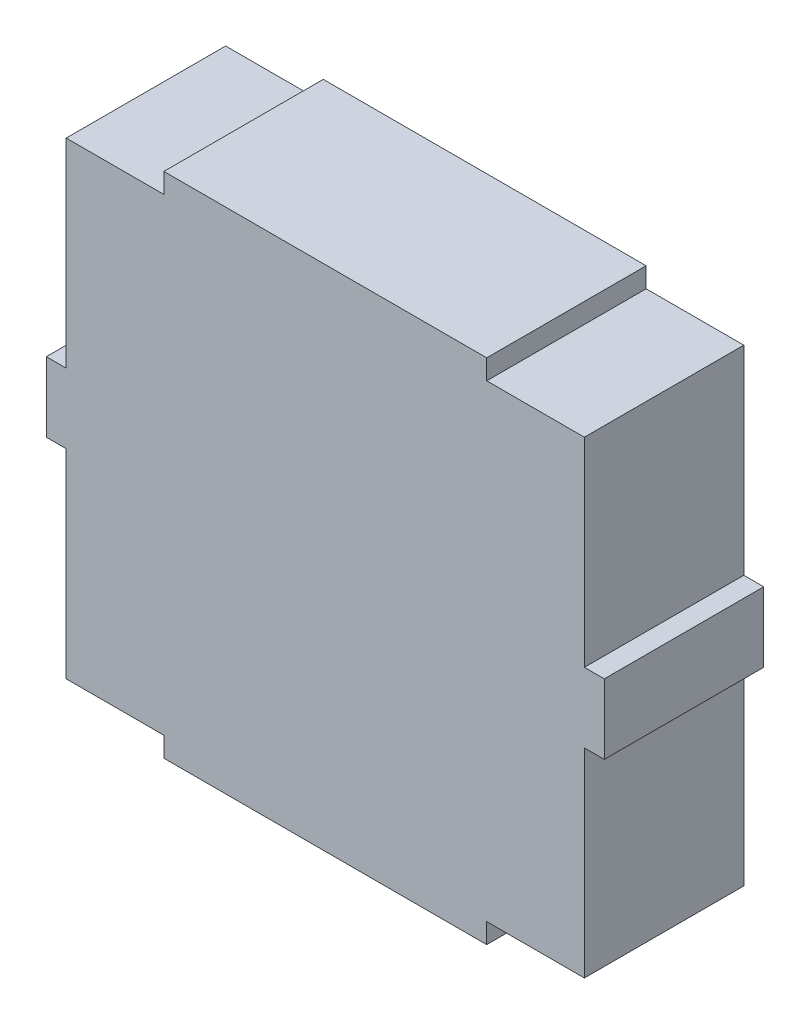
ISO-10303-21;
HEADER;
FILE_DESCRIPTION(('STEP AP214'),'2;1');
FILE_NAME('part.step','',(''),(''),'','','');
FILE_SCHEMA(('AUTOMOTIVE_DESIGN { 1 0 10303 214 1 1 1 1 }'));
ENDSEC;
DATA;
#1=APPLICATION_CONTEXT('core data for automotive mechanical design processes');
#2=APPLICATION_PROTOCOL_DEFINITION('international standard','automotive_design',2000,#1);
#3=PRODUCT_CONTEXT('',#1,'mechanical');
#4=PRODUCT('Part','Part','',(#3));
#5=PRODUCT_RELATED_PRODUCT_CATEGORY('part','',(#4));
#6=PRODUCT_DEFINITION_FORMATION('','',#4);
#7=PRODUCT_DEFINITION_CONTEXT('part definition',#1,'design');
#8=PRODUCT_DEFINITION('design','',#6,#7);
#9=PRODUCT_DEFINITION_SHAPE('','',#8);
#10=(LENGTH_UNIT() NAMED_UNIT(*) SI_UNIT(.MILLI.,.METRE.));
#11=(NAMED_UNIT(*) PLANE_ANGLE_UNIT() SI_UNIT($,.RADIAN.));
#12=(NAMED_UNIT(*) SI_UNIT($,.STERADIAN.) SOLID_ANGLE_UNIT());
#13=UNCERTAINTY_MEASURE_WITH_UNIT(LENGTH_MEASURE(1.E-05),#10,'distance_accuracy_value','');
#14=(GEOMETRIC_REPRESENTATION_CONTEXT(3) GLOBAL_UNCERTAINTY_ASSIGNED_CONTEXT((#13)) GLOBAL_UNIT_ASSIGNED_CONTEXT((#10,
#11,#12)) REPRESENTATION_CONTEXT('',''));
#15=CARTESIAN_POINT('',(0.,0.,0.));
#16=DIRECTION('',(0.,0.,1.));
#17=DIRECTION('',(1.,0.,0.));
#18=AXIS2_PLACEMENT_3D('',#15,#16,#17);
#19=CARTESIAN_POINT('',(1.62,-2.55,1.6));
#20=DIRECTION('',(0.,1.,0.));
#21=DIRECTION('',(0.,0.,1.));
#22=AXIS2_PLACEMENT_3D('',#19,#20,#21);
#23=PLANE('',#22);
#24=DIRECTION('',(1.,0.,0.));
#25=VECTOR('',#24,1.);
#26=CARTESIAN_POINT('',(1.62,-2.55,0.));
#27=LINE('',#26,#25);
#28=CARTESIAN_POINT('',(-1.62,-2.55,0.));
#29=VERTEX_POINT('',#28);
#30=CARTESIAN_POINT('',(1.62,-2.55,0.));
#31=VERTEX_POINT('',#30);
#32=EDGE_CURVE('E201',#29,#31,#27,.T.);
#33=ORIENTED_EDGE('',*,*,#32,.T.);
#34=DIRECTION('',(0.,0.,-1.));
#35=VECTOR('',#34,1.);
#36=CARTESIAN_POINT('',(1.62,-2.55,1.6));
#37=LINE('',#36,#35);
#38=CARTESIAN_POINT('',(1.62,-2.55,1.6));
#39=VERTEX_POINT('',#38);
#40=EDGE_CURVE('E11',#39,#31,#37,.T.);
#41=ORIENTED_EDGE('',*,*,#40,.F.);
#42=DIRECTION('',(1.,0.,0.));
#43=VECTOR('',#42,1.);
#44=CARTESIAN_POINT('',(1.62,-2.55,1.6));
#45=LINE('',#44,#43);
#46=CARTESIAN_POINT('',(-1.62,-2.55,1.6));
#47=VERTEX_POINT('',#46);
#48=EDGE_CURVE('E240',#47,#39,#45,.T.);
#49=ORIENTED_EDGE('',*,*,#48,.F.);
#50=DIRECTION('',(0.,0.,-1.));
#51=VECTOR('',#50,1.);
#52=CARTESIAN_POINT('',(-1.62,-2.55,1.6));
#53=LINE('',#52,#51);
#54=EDGE_CURVE('E197',#47,#29,#53,.T.);
#55=ORIENTED_EDGE('',*,*,#54,.T.);
#56=EDGE_LOOP('',(#33,#41,#49,#55));
#57=FACE_BOUND('',#56,.T.);
#58=ADVANCED_FACE('F34',(#57),#23,.F.);
#59=CARTESIAN_POINT('',(1.62,-2.35,1.6));
#60=DIRECTION('',(-1.,0.,0.));
#61=DIRECTION('',(0.,0.,1.));
#62=AXIS2_PLACEMENT_3D('',#59,#60,#61);
#63=PLANE('',#62);
#64=DIRECTION('',(0.,1.,0.));
#65=VECTOR('',#64,1.);
#66=CARTESIAN_POINT('',(1.62,-2.35,0.));
#67=LINE('',#66,#65);
#68=CARTESIAN_POINT('',(1.62,-2.35,0.));
#69=VERTEX_POINT('',#68);
#70=EDGE_CURVE('E204',#31,#69,#67,.T.);
#71=ORIENTED_EDGE('',*,*,#70,.T.);
#72=DIRECTION('',(0.,0.,-1.));
#73=VECTOR('',#72,1.);
#74=CARTESIAN_POINT('',(1.62,-2.35,1.6));
#75=LINE('',#74,#73);
#76=CARTESIAN_POINT('',(1.62,-2.35,1.6));
#77=VERTEX_POINT('',#76);
#78=EDGE_CURVE('E42',#77,#69,#75,.T.);
#79=ORIENTED_EDGE('',*,*,#78,.F.);
#80=DIRECTION('',(0.,1.,0.));
#81=VECTOR('',#80,1.);
#82=CARTESIAN_POINT('',(1.62,-2.35,1.6));
#83=LINE('',#82,#81);
#84=EDGE_CURVE('E129',#39,#77,#83,.T.);
#85=ORIENTED_EDGE('',*,*,#84,.F.);
#86=ORIENTED_EDGE('',*,*,#40,.T.);
#87=EDGE_LOOP('',(#71,#79,#85,#86));
#88=FACE_BOUND('',#87,.T.);
#89=ADVANCED_FACE('F359',(#88),#63,.F.);
#90=CARTESIAN_POINT('',(2.6,-2.35,1.6));
#91=DIRECTION('',(0.,1.,0.));
#92=DIRECTION('',(0.,0.,1.));
#93=AXIS2_PLACEMENT_3D('',#90,#91,#92);
#94=PLANE('',#93);
#95=DIRECTION('',(1.,0.,0.));
#96=VECTOR('',#95,1.);
#97=CARTESIAN_POINT('',(2.6,-2.35,0.));
#98=LINE('',#97,#96);
#99=CARTESIAN_POINT('',(2.6,-2.35,0.));
#100=VERTEX_POINT('',#99);
#101=EDGE_CURVE('E206',#69,#100,#98,.T.);
#102=ORIENTED_EDGE('',*,*,#101,.T.);
#103=DIRECTION('',(0.,0.,-1.));
#104=VECTOR('',#103,1.);
#105=CARTESIAN_POINT('',(2.6,-2.35,1.6));
#106=LINE('',#105,#104);
#107=CARTESIAN_POINT('',(2.6,-2.35,1.6));
#108=VERTEX_POINT('',#107);
#109=EDGE_CURVE('E283',#108,#100,#106,.T.);
#110=ORIENTED_EDGE('',*,*,#109,.F.);
#111=DIRECTION('',(1.,0.,0.));
#112=VECTOR('',#111,1.);
#113=CARTESIAN_POINT('',(2.6,-2.35,1.6));
#114=LINE('',#113,#112);
#115=EDGE_CURVE('E291',#77,#108,#114,.T.);
#116=ORIENTED_EDGE('',*,*,#115,.F.);
#117=ORIENTED_EDGE('',*,*,#78,.T.);
#118=EDGE_LOOP('',(#102,#110,#116,#117));
#119=FACE_BOUND('',#118,.T.);
#120=ADVANCED_FACE('F289',(#119),#94,.F.);
#121=CARTESIAN_POINT('',(2.6,-0.35,1.6));
#122=DIRECTION('',(-1.,0.,0.));
#123=DIRECTION('',(0.,0.,1.));
#124=AXIS2_PLACEMENT_3D('',#121,#122,#123);
#125=PLANE('',#124);
#126=DIRECTION('',(0.,1.,0.));
#127=VECTOR('',#126,1.);
#128=CARTESIAN_POINT('',(2.6,-0.35,0.));
#129=LINE('',#128,#127);
#130=CARTESIAN_POINT('',(2.6,-0.35,0.));
#131=VERTEX_POINT('',#130);
#132=EDGE_CURVE('E208',#100,#131,#129,.T.);
#133=ORIENTED_EDGE('',*,*,#132,.T.);
#134=DIRECTION('',(0.,0.,-1.));
#135=VECTOR('',#134,1.);
#136=CARTESIAN_POINT('',(2.6,-0.35,1.6));
#137=LINE('',#136,#135);
#138=CARTESIAN_POINT('',(2.6,-0.35,1.6));
#139=VERTEX_POINT('',#138);
#140=EDGE_CURVE('E280',#139,#131,#137,.T.);
#141=ORIENTED_EDGE('',*,*,#140,.F.);
#142=DIRECTION('',(0.,1.,0.));
#143=VECTOR('',#142,1.);
#144=CARTESIAN_POINT('',(2.6,-0.35,1.6));
#145=LINE('',#144,#143);
#146=EDGE_CURVE('E309',#108,#139,#145,.T.);
#147=ORIENTED_EDGE('',*,*,#146,.F.);
#148=ORIENTED_EDGE('',*,*,#109,.T.);
#149=EDGE_LOOP('',(#133,#141,#147,#148));
#150=FACE_BOUND('',#149,.T.);
#151=ADVANCED_FACE('F300',(#150),#125,.F.);
#152=CARTESIAN_POINT('',(2.8,-0.35,1.6));
#153=DIRECTION('',(0.,1.,0.));
#154=DIRECTION('',(0.,0.,1.));
#155=AXIS2_PLACEMENT_3D('',#152,#153,#154);
#156=PLANE('',#155);
#157=DIRECTION('',(1.,0.,0.));
#158=VECTOR('',#157,1.);
#159=CARTESIAN_POINT('',(2.8,-0.35,0.));
#160=LINE('',#159,#158);
#161=CARTESIAN_POINT('',(2.8,-0.35,0.));
#162=VERTEX_POINT('',#161);
#163=EDGE_CURVE('E210',#131,#162,#160,.T.);
#164=ORIENTED_EDGE('',*,*,#163,.T.);
#165=DIRECTION('',(0.,0.,-1.));
#166=VECTOR('',#165,1.);
#167=CARTESIAN_POINT('',(2.8,-0.35,1.6));
#168=LINE('',#167,#166);
#169=CARTESIAN_POINT('',(2.8,-0.35,1.6));
#170=VERTEX_POINT('',#169);
#171=EDGE_CURVE('E277',#170,#162,#168,.T.);
#172=ORIENTED_EDGE('',*,*,#171,.F.);
#173=DIRECTION('',(1.,0.,0.));
#174=VECTOR('',#173,1.);
#175=CARTESIAN_POINT('',(2.8,-0.35,1.6));
#176=LINE('',#175,#174);
#177=EDGE_CURVE('E306',#139,#170,#176,.T.);
#178=ORIENTED_EDGE('',*,*,#177,.F.);
#179=ORIENTED_EDGE('',*,*,#140,.T.);
#180=EDGE_LOOP('',(#164,#172,#178,#179));
#181=FACE_BOUND('',#180,.T.);
#182=ADVANCED_FACE('F304',(#181),#156,.F.);
#183=CARTESIAN_POINT('',(2.8,0.35,1.6));
#184=DIRECTION('',(-1.,0.,0.));
#185=DIRECTION('',(0.,0.,1.));
#186=AXIS2_PLACEMENT_3D('',#183,#184,#185);
#187=PLANE('',#186);
#188=DIRECTION('',(0.,1.,0.));
#189=VECTOR('',#188,1.);
#190=CARTESIAN_POINT('',(2.8,0.35,0.));
#191=LINE('',#190,#189);
#192=CARTESIAN_POINT('',(2.8,0.35,0.));
#193=VERTEX_POINT('',#192);
#194=EDGE_CURVE('E212',#162,#193,#191,.T.);
#195=ORIENTED_EDGE('',*,*,#194,.T.);
#196=DIRECTION('',(0.,0.,-1.));
#197=VECTOR('',#196,1.);
#198=CARTESIAN_POINT('',(2.8,0.35,1.6));
#199=LINE('',#198,#197);
#200=CARTESIAN_POINT('',(2.8,0.35,1.6));
#201=VERTEX_POINT('',#200);
#202=EDGE_CURVE('E274',#201,#193,#199,.T.);
#203=ORIENTED_EDGE('',*,*,#202,.F.);
#204=DIRECTION('',(0.,1.,0.));
#205=VECTOR('',#204,1.);
#206=CARTESIAN_POINT('',(2.8,0.35,1.6));
#207=LINE('',#206,#205);
#208=EDGE_CURVE('E308',#170,#201,#207,.T.);
#209=ORIENTED_EDGE('',*,*,#208,.F.);
#210=ORIENTED_EDGE('',*,*,#171,.T.);
#211=EDGE_LOOP('',(#195,#203,#209,#210));
#212=FACE_BOUND('',#211,.T.);
#213=ADVANCED_FACE('F372',(#212),#187,.F.);
#214=CARTESIAN_POINT('',(2.6,0.35,1.6));
#215=DIRECTION('',(0.,-1.,0.));
#216=DIRECTION('',(0.,0.,-1.));
#217=AXIS2_PLACEMENT_3D('',#214,#215,#216);
#218=PLANE('',#217);
#219=DIRECTION('',(-1.,0.,0.));
#220=VECTOR('',#219,1.);
#221=CARTESIAN_POINT('',(2.6,0.35,0.));
#222=LINE('',#221,#220);
#223=CARTESIAN_POINT('',(2.6,0.35,0.));
#224=VERTEX_POINT('',#223);
#225=EDGE_CURVE('E214',#193,#224,#222,.T.);
#226=ORIENTED_EDGE('',*,*,#225,.T.);
#227=DIRECTION('',(0.,0.,-1.));
#228=VECTOR('',#227,1.);
#229=CARTESIAN_POINT('',(2.6,0.35,1.6));
#230=LINE('',#229,#228);
#231=CARTESIAN_POINT('',(2.6,0.35,1.6));
#232=VERTEX_POINT('',#231);
#233=EDGE_CURVE('E271',#232,#224,#230,.T.);
#234=ORIENTED_EDGE('',*,*,#233,.F.);
#235=DIRECTION('',(-1.,0.,0.));
#236=VECTOR('',#235,1.);
#237=CARTESIAN_POINT('',(2.6,0.35,1.6));
#238=LINE('',#237,#236);
#239=EDGE_CURVE('E311',#201,#232,#238,.T.);
#240=ORIENTED_EDGE('',*,*,#239,.F.);
#241=ORIENTED_EDGE('',*,*,#202,.T.);
#242=EDGE_LOOP('',(#226,#234,#240,#241));
#243=FACE_BOUND('',#242,.T.);
#244=ADVANCED_FACE('F375',(#243),#218,.F.);
#245=CARTESIAN_POINT('',(2.6,2.35,1.6));
#246=DIRECTION('',(-1.,0.,0.));
#247=DIRECTION('',(0.,0.,1.));
#248=AXIS2_PLACEMENT_3D('',#245,#246,#247);
#249=PLANE('',#248);
#250=DIRECTION('',(0.,1.,0.));
#251=VECTOR('',#250,1.);
#252=CARTESIAN_POINT('',(2.6,2.35,0.));
#253=LINE('',#252,#251);
#254=CARTESIAN_POINT('',(2.6,2.35,0.));
#255=VERTEX_POINT('',#254);
#256=EDGE_CURVE('E216',#224,#255,#253,.T.);
#257=ORIENTED_EDGE('',*,*,#256,.T.);
#258=DIRECTION('',(0.,0.,-1.));
#259=VECTOR('',#258,1.);
#260=CARTESIAN_POINT('',(2.6,2.35,1.6));
#261=LINE('',#260,#259);
#262=CARTESIAN_POINT('',(2.6,2.35,1.6));
#263=VERTEX_POINT('',#262);
#264=EDGE_CURVE('E268',#263,#255,#261,.T.);
#265=ORIENTED_EDGE('',*,*,#264,.F.);
#266=DIRECTION('',(0.,1.,0.));
#267=VECTOR('',#266,1.);
#268=CARTESIAN_POINT('',(2.6,2.35,1.6));
#269=LINE('',#268,#267);
#270=EDGE_CURVE('E317',#232,#263,#269,.T.);
#271=ORIENTED_EDGE('',*,*,#270,.F.);
#272=ORIENTED_EDGE('',*,*,#233,.T.);
#273=EDGE_LOOP('',(#257,#265,#271,#272));
#274=FACE_BOUND('',#273,.T.);
#275=ADVANCED_FACE('F379',(#274),#249,.F.);
#276=CARTESIAN_POINT('',(1.62,2.35,1.6));
#277=DIRECTION('',(0.,-1.,0.));
#278=DIRECTION('',(0.,0.,-1.));
#279=AXIS2_PLACEMENT_3D('',#276,#277,#278);
#280=PLANE('',#279);
#281=DIRECTION('',(-1.,0.,0.));
#282=VECTOR('',#281,1.);
#283=CARTESIAN_POINT('',(1.62,2.35,0.));
#284=LINE('',#283,#282);
#285=CARTESIAN_POINT('',(1.62,2.35,0.));
#286=VERTEX_POINT('',#285);
#287=EDGE_CURVE('E218',#255,#286,#284,.T.);
#288=ORIENTED_EDGE('',*,*,#287,.T.);
#289=DIRECTION('',(0.,0.,-1.));
#290=VECTOR('',#289,1.);
#291=CARTESIAN_POINT('',(1.62,2.35,1.6));
#292=LINE('',#291,#290);
#293=CARTESIAN_POINT('',(1.62,2.35,1.6));
#294=VERTEX_POINT('',#293);
#295=EDGE_CURVE('E265',#294,#286,#292,.T.);
#296=ORIENTED_EDGE('',*,*,#295,.F.);
#297=DIRECTION('',(-1.,0.,0.));
#298=VECTOR('',#297,1.);
#299=CARTESIAN_POINT('',(1.62,2.35,1.6));
#300=LINE('',#299,#298);
#301=EDGE_CURVE('E319',#263,#294,#300,.T.);
#302=ORIENTED_EDGE('',*,*,#301,.F.);
#303=ORIENTED_EDGE('',*,*,#264,.T.);
#304=EDGE_LOOP('',(#288,#296,#302,#303));
#305=FACE_BOUND('',#304,.T.);
#306=ADVANCED_FACE('F383',(#305),#280,.F.);
#307=CARTESIAN_POINT('',(1.62,2.55,1.6));
#308=DIRECTION('',(-1.,0.,0.));
#309=DIRECTION('',(0.,0.,1.));
#310=AXIS2_PLACEMENT_3D('',#307,#308,#309);
#311=PLANE('',#310);
#312=DIRECTION('',(0.,1.,0.));
#313=VECTOR('',#312,1.);
#314=CARTESIAN_POINT('',(1.62,2.55,0.));
#315=LINE('',#314,#313);
#316=CARTESIAN_POINT('',(1.62,2.55,0.));
#317=VERTEX_POINT('',#316);
#318=EDGE_CURVE('E220',#286,#317,#315,.T.);
#319=ORIENTED_EDGE('',*,*,#318,.T.);
#320=DIRECTION('',(0.,0.,-1.));
#321=VECTOR('',#320,1.);
#322=CARTESIAN_POINT('',(1.62,2.55,1.6));
#323=LINE('',#322,#321);
#324=CARTESIAN_POINT('',(1.62,2.55,1.6));
#325=VERTEX_POINT('',#324);
#326=EDGE_CURVE('E262',#325,#317,#323,.T.);
#327=ORIENTED_EDGE('',*,*,#326,.F.);
#328=DIRECTION('',(0.,1.,0.));
#329=VECTOR('',#328,1.);
#330=CARTESIAN_POINT('',(1.62,2.55,1.6));
#331=LINE('',#330,#329);
#332=EDGE_CURVE('E321',#294,#325,#331,.T.);
#333=ORIENTED_EDGE('',*,*,#332,.F.);
#334=ORIENTED_EDGE('',*,*,#295,.T.);
#335=EDGE_LOOP('',(#319,#327,#333,#334));
#336=FACE_BOUND('',#335,.T.);
#337=ADVANCED_FACE('F387',(#336),#311,.F.);
#338=CARTESIAN_POINT('',(-1.62,2.55,1.6));
#339=DIRECTION('',(0.,-1.,0.));
#340=DIRECTION('',(0.,0.,-1.));
#341=AXIS2_PLACEMENT_3D('',#338,#339,#340);
#342=PLANE('',#341);
#343=DIRECTION('',(-1.,0.,0.));
#344=VECTOR('',#343,1.);
#345=CARTESIAN_POINT('',(-1.62,2.55,0.));
#346=LINE('',#345,#344);
#347=CARTESIAN_POINT('',(-1.62,2.55,0.));
#348=VERTEX_POINT('',#347);
#349=EDGE_CURVE('E222',#317,#348,#346,.T.);
#350=ORIENTED_EDGE('',*,*,#349,.T.);
#351=DIRECTION('',(0.,0.,-1.));
#352=VECTOR('',#351,1.);
#353=CARTESIAN_POINT('',(-1.62,2.55,1.6));
#354=LINE('',#353,#352);
#355=CARTESIAN_POINT('',(-1.62,2.55,1.6));
#356=VERTEX_POINT('',#355);
#357=EDGE_CURVE('E259',#356,#348,#354,.T.);
#358=ORIENTED_EDGE('',*,*,#357,.F.);
#359=DIRECTION('',(-1.,0.,0.));
#360=VECTOR('',#359,1.);
#361=CARTESIAN_POINT('',(-1.62,2.55,1.6));
#362=LINE('',#361,#360);
#363=EDGE_CURVE('E323',#325,#356,#362,.T.);
#364=ORIENTED_EDGE('',*,*,#363,.F.);
#365=ORIENTED_EDGE('',*,*,#326,.T.);
#366=EDGE_LOOP('',(#350,#358,#364,#365));
#367=FACE_BOUND('',#366,.T.);
#368=ADVANCED_FACE('F391',(#367),#342,.F.);
#369=CARTESIAN_POINT('',(-1.62,2.35,1.6));
#370=DIRECTION('',(1.,0.,0.));
#371=DIRECTION('',(0.,0.,-1.));
#372=AXIS2_PLACEMENT_3D('',#369,#370,#371);
#373=PLANE('',#372);
#374=DIRECTION('',(0.,-1.,0.));
#375=VECTOR('',#374,1.);
#376=CARTESIAN_POINT('',(-1.62,2.35,0.));
#377=LINE('',#376,#375);
#378=CARTESIAN_POINT('',(-1.62,2.35,0.));
#379=VERTEX_POINT('',#378);
#380=EDGE_CURVE('E224',#348,#379,#377,.T.);
#381=ORIENTED_EDGE('',*,*,#380,.T.);
#382=DIRECTION('',(0.,0.,-1.));
#383=VECTOR('',#382,1.);
#384=CARTESIAN_POINT('',(-1.62,2.35,1.6));
#385=LINE('',#384,#383);
#386=CARTESIAN_POINT('',(-1.62,2.35,1.6));
#387=VERTEX_POINT('',#386);
#388=EDGE_CURVE('E256',#387,#379,#385,.T.);
#389=ORIENTED_EDGE('',*,*,#388,.F.);
#390=DIRECTION('',(0.,-1.,0.));
#391=VECTOR('',#390,1.);
#392=CARTESIAN_POINT('',(-1.62,2.35,1.6));
#393=LINE('',#392,#391);
#394=EDGE_CURVE('E325',#356,#387,#393,.T.);
#395=ORIENTED_EDGE('',*,*,#394,.F.);
#396=ORIENTED_EDGE('',*,*,#357,.T.);
#397=EDGE_LOOP('',(#381,#389,#395,#396));
#398=FACE_BOUND('',#397,.T.);
#399=ADVANCED_FACE('F395',(#398),#373,.F.);
#400=CARTESIAN_POINT('',(-2.6,2.35,1.6));
#401=DIRECTION('',(0.,-1.,0.));
#402=DIRECTION('',(0.,0.,-1.));
#403=AXIS2_PLACEMENT_3D('',#400,#401,#402);
#404=PLANE('',#403);
#405=DIRECTION('',(-1.,0.,0.));
#406=VECTOR('',#405,1.);
#407=CARTESIAN_POINT('',(-2.6,2.35,0.));
#408=LINE('',#407,#406);
#409=CARTESIAN_POINT('',(-2.6,2.35,0.));
#410=VERTEX_POINT('',#409);
#411=EDGE_CURVE('E226',#379,#410,#408,.T.);
#412=ORIENTED_EDGE('',*,*,#411,.T.);
#413=DIRECTION('',(0.,0.,-1.));
#414=VECTOR('',#413,1.);
#415=CARTESIAN_POINT('',(-2.6,2.35,1.6));
#416=LINE('',#415,#414);
#417=CARTESIAN_POINT('',(-2.6,2.35,1.6));
#418=VERTEX_POINT('',#417);
#419=EDGE_CURVE('E253',#418,#410,#416,.T.);
#420=ORIENTED_EDGE('',*,*,#419,.F.);
#421=DIRECTION('',(-1.,0.,0.));
#422=VECTOR('',#421,1.);
#423=CARTESIAN_POINT('',(-2.6,2.35,1.6));
#424=LINE('',#423,#422);
#425=EDGE_CURVE('E327',#387,#418,#424,.T.);
#426=ORIENTED_EDGE('',*,*,#425,.F.);
#427=ORIENTED_EDGE('',*,*,#388,.T.);
#428=EDGE_LOOP('',(#412,#420,#426,#427));
#429=FACE_BOUND('',#428,.T.);
#430=ADVANCED_FACE('F399',(#429),#404,.F.);
#431=CARTESIAN_POINT('',(-2.6,0.35,1.6));
#432=DIRECTION('',(1.,0.,0.));
#433=DIRECTION('',(0.,0.,-1.));
#434=AXIS2_PLACEMENT_3D('',#431,#432,#433);
#435=PLANE('',#434);
#436=DIRECTION('',(0.,-1.,0.));
#437=VECTOR('',#436,1.);
#438=CARTESIAN_POINT('',(-2.6,0.35,0.));
#439=LINE('',#438,#437);
#440=CARTESIAN_POINT('',(-2.6,0.35,0.));
#441=VERTEX_POINT('',#440);
#442=EDGE_CURVE('E228',#410,#441,#439,.T.);
#443=ORIENTED_EDGE('',*,*,#442,.T.);
#444=DIRECTION('',(0.,0.,-1.));
#445=VECTOR('',#444,1.);
#446=CARTESIAN_POINT('',(-2.6,0.35,1.6));
#447=LINE('',#446,#445);
#448=CARTESIAN_POINT('',(-2.6,0.35,1.6));
#449=VERTEX_POINT('',#448);
#450=EDGE_CURVE('E250',#449,#441,#447,.T.);
#451=ORIENTED_EDGE('',*,*,#450,.F.);
#452=DIRECTION('',(0.,-1.,0.));
#453=VECTOR('',#452,1.);
#454=CARTESIAN_POINT('',(-2.6,0.35,1.6));
#455=LINE('',#454,#453);
#456=EDGE_CURVE('E329',#418,#449,#455,.T.);
#457=ORIENTED_EDGE('',*,*,#456,.F.);
#458=ORIENTED_EDGE('',*,*,#419,.T.);
#459=EDGE_LOOP('',(#443,#451,#457,#458));
#460=FACE_BOUND('',#459,.T.);
#461=ADVANCED_FACE('F403',(#460),#435,.F.);
#462=CARTESIAN_POINT('',(-2.8,0.35,1.6));
#463=DIRECTION('',(0.,-1.,0.));
#464=DIRECTION('',(0.,0.,-1.));
#465=AXIS2_PLACEMENT_3D('',#462,#463,#464);
#466=PLANE('',#465);
#467=DIRECTION('',(-1.,0.,0.));
#468=VECTOR('',#467,1.);
#469=CARTESIAN_POINT('',(-2.8,0.35,0.));
#470=LINE('',#469,#468);
#471=CARTESIAN_POINT('',(-2.8,0.35,0.));
#472=VERTEX_POINT('',#471);
#473=EDGE_CURVE('E230',#441,#472,#470,.T.);
#474=ORIENTED_EDGE('',*,*,#473,.T.);
#475=DIRECTION('',(0.,0.,-1.));
#476=VECTOR('',#475,1.);
#477=CARTESIAN_POINT('',(-2.8,0.35,1.6));
#478=LINE('',#477,#476);
#479=CARTESIAN_POINT('',(-2.8,0.35,1.6));
#480=VERTEX_POINT('',#479);
#481=EDGE_CURVE('E247',#480,#472,#478,.T.);
#482=ORIENTED_EDGE('',*,*,#481,.F.);
#483=DIRECTION('',(-1.,0.,0.));
#484=VECTOR('',#483,1.);
#485=CARTESIAN_POINT('',(-2.8,0.35,1.6));
#486=LINE('',#485,#484);
#487=EDGE_CURVE('E331',#449,#480,#486,.T.);
#488=ORIENTED_EDGE('',*,*,#487,.F.);
#489=ORIENTED_EDGE('',*,*,#450,.T.);
#490=EDGE_LOOP('',(#474,#482,#488,#489));
#491=FACE_BOUND('',#490,.T.);
#492=ADVANCED_FACE('F407',(#491),#466,.F.);
#493=CARTESIAN_POINT('',(-2.8,-0.35,1.6));
#494=DIRECTION('',(1.,0.,0.));
#495=DIRECTION('',(0.,0.,-1.));
#496=AXIS2_PLACEMENT_3D('',#493,#494,#495);
#497=PLANE('',#496);
#498=DIRECTION('',(0.,-1.,0.));
#499=VECTOR('',#498,1.);
#500=CARTESIAN_POINT('',(-2.8,-0.35,0.));
#501=LINE('',#500,#499);
#502=CARTESIAN_POINT('',(-2.8,-0.35,0.));
#503=VERTEX_POINT('',#502);
#504=EDGE_CURVE('E232',#472,#503,#501,.T.);
#505=ORIENTED_EDGE('',*,*,#504,.T.);
#506=DIRECTION('',(0.,0.,-1.));
#507=VECTOR('',#506,1.);
#508=CARTESIAN_POINT('',(-2.8,-0.35,1.6));
#509=LINE('',#508,#507);
#510=CARTESIAN_POINT('',(-2.8,-0.35,1.6));
#511=VERTEX_POINT('',#510);
#512=EDGE_CURVE('E244',#511,#503,#509,.T.);
#513=ORIENTED_EDGE('',*,*,#512,.F.);
#514=DIRECTION('',(0.,-1.,0.));
#515=VECTOR('',#514,1.);
#516=CARTESIAN_POINT('',(-2.8,-0.35,1.6));
#517=LINE('',#516,#515);
#518=EDGE_CURVE('E333',#480,#511,#517,.T.);
#519=ORIENTED_EDGE('',*,*,#518,.F.);
#520=ORIENTED_EDGE('',*,*,#481,.T.);
#521=EDGE_LOOP('',(#505,#513,#519,#520));
#522=FACE_BOUND('',#521,.T.);
#523=ADVANCED_FACE('F339',(#522),#497,.F.);
#524=CARTESIAN_POINT('',(-2.6,-0.35,1.6));
#525=DIRECTION('',(0.,1.,0.));
#526=DIRECTION('',(0.,0.,1.));
#527=AXIS2_PLACEMENT_3D('',#524,#525,#526);
#528=PLANE('',#527);
#529=DIRECTION('',(1.,0.,0.));
#530=VECTOR('',#529,1.);
#531=CARTESIAN_POINT('',(-2.6,-0.35,0.));
#532=LINE('',#531,#530);
#533=CARTESIAN_POINT('',(-2.6,-0.35,0.));
#534=VERTEX_POINT('',#533);
#535=EDGE_CURVE('E234',#503,#534,#532,.T.);
#536=ORIENTED_EDGE('',*,*,#535,.T.);
#537=DIRECTION('',(0.,0.,-1.));
#538=VECTOR('',#537,1.);
#539=CARTESIAN_POINT('',(-2.6,-0.35,1.6));
#540=LINE('',#539,#538);
#541=CARTESIAN_POINT('',(-2.6,-0.35,1.6));
#542=VERTEX_POINT('',#541);
#543=EDGE_CURVE('E192',#542,#534,#540,.T.);
#544=ORIENTED_EDGE('',*,*,#543,.F.);
#545=DIRECTION('',(1.,0.,0.));
#546=VECTOR('',#545,1.);
#547=CARTESIAN_POINT('',(-2.6,-0.35,1.6));
#548=LINE('',#547,#546);
#549=EDGE_CURVE('E184',#511,#542,#548,.T.);
#550=ORIENTED_EDGE('',*,*,#549,.F.);
#551=ORIENTED_EDGE('',*,*,#512,.T.);
#552=EDGE_LOOP('',(#536,#544,#550,#551));
#553=FACE_BOUND('',#552,.T.);
#554=ADVANCED_FACE('F343',(#553),#528,.F.);
#555=CARTESIAN_POINT('',(-2.6,-2.35,1.6));
#556=DIRECTION('',(1.,0.,0.));
#557=DIRECTION('',(0.,0.,-1.));
#558=AXIS2_PLACEMENT_3D('',#555,#556,#557);
#559=PLANE('',#558);
#560=DIRECTION('',(0.,-1.,0.));
#561=VECTOR('',#560,1.);
#562=CARTESIAN_POINT('',(-2.6,-2.35,0.));
#563=LINE('',#562,#561);
#564=CARTESIAN_POINT('',(-2.6,-2.35,0.));
#565=VERTEX_POINT('',#564);
#566=EDGE_CURVE('E191',#534,#565,#563,.T.);
#567=ORIENTED_EDGE('',*,*,#566,.T.);
#568=DIRECTION('',(0.,0.,-1.));
#569=VECTOR('',#568,1.);
#570=CARTESIAN_POINT('',(-2.6,-2.35,1.6));
#571=LINE('',#570,#569);
#572=CARTESIAN_POINT('',(-2.6,-2.35,1.6));
#573=VERTEX_POINT('',#572);
#574=EDGE_CURVE('E189',#573,#565,#571,.T.);
#575=ORIENTED_EDGE('',*,*,#574,.F.);
#576=DIRECTION('',(0.,-1.,0.));
#577=VECTOR('',#576,1.);
#578=CARTESIAN_POINT('',(-2.6,-2.18,1.6));
#579=LINE('',#578,#577);
#580=EDGE_CURVE('E178',#542,#573,#579,.T.);
#581=ORIENTED_EDGE('',*,*,#580,.F.);
#582=ORIENTED_EDGE('',*,*,#543,.T.);
#583=EDGE_LOOP('',(#567,#575,#581,#582));
#584=FACE_BOUND('',#583,.T.);
#585=ADVANCED_FACE('F190',(#584),#559,.F.);
#586=CARTESIAN_POINT('',(-1.62,-2.35,1.6));
#587=DIRECTION('',(0.,1.,0.));
#588=DIRECTION('',(0.,0.,1.));
#589=AXIS2_PLACEMENT_3D('',#586,#587,#588);
#590=PLANE('',#589);
#591=DIRECTION('',(1.,0.,0.));
#592=VECTOR('',#591,1.);
#593=CARTESIAN_POINT('',(-1.62,-2.35,0.));
#594=LINE('',#593,#592);
#595=CARTESIAN_POINT('',(-1.62,-2.35,0.));
#596=VERTEX_POINT('',#595);
#597=EDGE_CURVE('E115',#565,#596,#594,.T.);
#598=ORIENTED_EDGE('',*,*,#597,.T.);
#599=DIRECTION('',(0.,0.,-1.));
#600=VECTOR('',#599,1.);
#601=CARTESIAN_POINT('',(-1.62,-2.35,1.6));
#602=LINE('',#601,#600);
#603=CARTESIAN_POINT('',(-1.62,-2.35,1.6));
#604=VERTEX_POINT('',#603);
#605=EDGE_CURVE('E193',#604,#596,#602,.T.);
#606=ORIENTED_EDGE('',*,*,#605,.F.);
#607=DIRECTION('',(1.,0.,0.));
#608=VECTOR('',#607,1.);
#609=CARTESIAN_POINT('',(-1.62,-2.35,1.6));
#610=LINE('',#609,#608);
#611=EDGE_CURVE('E182',#573,#604,#610,.T.);
#612=ORIENTED_EDGE('',*,*,#611,.F.);
#613=ORIENTED_EDGE('',*,*,#574,.T.);
#614=EDGE_LOOP('',(#598,#606,#612,#613));
#615=FACE_BOUND('',#614,.T.);
#616=ADVANCED_FACE('F195',(#615),#590,.F.);
#617=CARTESIAN_POINT('',(-1.62,-2.55,1.6));
#618=DIRECTION('',(1.,0.,0.));
#619=DIRECTION('',(0.,0.,-1.));
#620=AXIS2_PLACEMENT_3D('',#617,#618,#619);
#621=PLANE('',#620);
#622=DIRECTION('',(0.,-1.,0.));
#623=VECTOR('',#622,1.);
#624=CARTESIAN_POINT('',(-1.62,-2.55,0.));
#625=LINE('',#624,#623);
#626=EDGE_CURVE('E121',#596,#29,#625,.T.);
#627=ORIENTED_EDGE('',*,*,#626,.T.);
#628=ORIENTED_EDGE('',*,*,#54,.F.);
#629=DIRECTION('',(0.,-1.,0.));
#630=VECTOR('',#629,1.);
#631=CARTESIAN_POINT('',(-1.62,-2.55,1.6));
#632=LINE('',#631,#630);
#633=EDGE_CURVE('E50',#604,#47,#632,.T.);
#634=ORIENTED_EDGE('',*,*,#633,.F.);
#635=ORIENTED_EDGE('',*,*,#605,.T.);
#636=EDGE_LOOP('',(#627,#628,#634,#635));
#637=FACE_BOUND('',#636,.T.);
#638=ADVANCED_FACE('F348',(#637),#621,.F.);
#639=CARTESIAN_POINT('',(0.,0.,1.6));
#640=DIRECTION('',(0.,0.,-1.));
#641=DIRECTION('',(-1.,0.,0.));
#642=AXIS2_PLACEMENT_3D('',#639,#640,#641);
#643=PLANE('',#642);
#644=ORIENTED_EDGE('',*,*,#48,.T.);
#645=ORIENTED_EDGE('',*,*,#84,.T.);
#646=ORIENTED_EDGE('',*,*,#115,.T.);
#647=ORIENTED_EDGE('',*,*,#146,.T.);
#648=ORIENTED_EDGE('',*,*,#177,.T.);
#649=ORIENTED_EDGE('',*,*,#208,.T.);
#650=ORIENTED_EDGE('',*,*,#239,.T.);
#651=ORIENTED_EDGE('',*,*,#270,.T.);
#652=ORIENTED_EDGE('',*,*,#301,.T.);
#653=ORIENTED_EDGE('',*,*,#332,.T.);
#654=ORIENTED_EDGE('',*,*,#363,.T.);
#655=ORIENTED_EDGE('',*,*,#394,.T.);
#656=ORIENTED_EDGE('',*,*,#425,.T.);
#657=ORIENTED_EDGE('',*,*,#456,.T.);
#658=ORIENTED_EDGE('',*,*,#487,.T.);
#659=ORIENTED_EDGE('',*,*,#518,.T.);
#660=ORIENTED_EDGE('',*,*,#549,.T.);
#661=ORIENTED_EDGE('',*,*,#580,.T.);
#662=ORIENTED_EDGE('',*,*,#611,.T.);
#663=ORIENTED_EDGE('',*,*,#633,.T.);
#664=EDGE_LOOP('',(#644,#645,#646,#647,#648,#649,#650,#651,#652,#653,#654,#655,#656,#657,#658,
#659,#660,#661,#662,#663));
#665=FACE_BOUND('',#664,.T.);
#666=ADVANCED_FACE('F180',(#665),#643,.F.);
#667=CARTESIAN_POINT('',(0.,0.,0.));
#668=DIRECTION('',(0.,0.,-1.));
#669=DIRECTION('',(-1.,0.,0.));
#670=AXIS2_PLACEMENT_3D('',#667,#668,#669);
#671=PLANE('',#670);
#672=ORIENTED_EDGE('',*,*,#32,.F.);
#673=ORIENTED_EDGE('',*,*,#626,.F.);
#674=ORIENTED_EDGE('',*,*,#597,.F.);
#675=ORIENTED_EDGE('',*,*,#566,.F.);
#676=ORIENTED_EDGE('',*,*,#535,.F.);
#677=ORIENTED_EDGE('',*,*,#504,.F.);
#678=ORIENTED_EDGE('',*,*,#473,.F.);
#679=ORIENTED_EDGE('',*,*,#442,.F.);
#680=ORIENTED_EDGE('',*,*,#411,.F.);
#681=ORIENTED_EDGE('',*,*,#380,.F.);
#682=ORIENTED_EDGE('',*,*,#349,.F.);
#683=ORIENTED_EDGE('',*,*,#318,.F.);
#684=ORIENTED_EDGE('',*,*,#287,.F.);
#685=ORIENTED_EDGE('',*,*,#256,.F.);
#686=ORIENTED_EDGE('',*,*,#225,.F.);
#687=ORIENTED_EDGE('',*,*,#194,.F.);
#688=ORIENTED_EDGE('',*,*,#163,.F.);
#689=ORIENTED_EDGE('',*,*,#132,.F.);
#690=ORIENTED_EDGE('',*,*,#101,.F.);
#691=ORIENTED_EDGE('',*,*,#70,.F.);
#692=EDGE_LOOP('',(#672,#673,#674,#675,#676,#677,#678,#679,#680,#681,#682,#683,#684,#685,#686,
#687,#688,#689,#690,#691));
#693=FACE_BOUND('',#692,.T.);
#694=ADVANCED_FACE('F295',(#693),#671,.T.);
#695=CLOSED_SHELL('',(#58,#89,#120,#151,#182,#213,#244,#275,#306,#337,#368,#399,#430,#461,#492,
#523,#554,#585,#616,#638,#666,#694));
#696=MANIFOLD_SOLID_BREP('B2',#695);
#697=ADVANCED_BREP_SHAPE_REPRESENTATION('',(#18,#696),#14);
#698=SHAPE_DEFINITION_REPRESENTATION(#9,#697);
ENDSEC;
END-ISO-10303-21;
